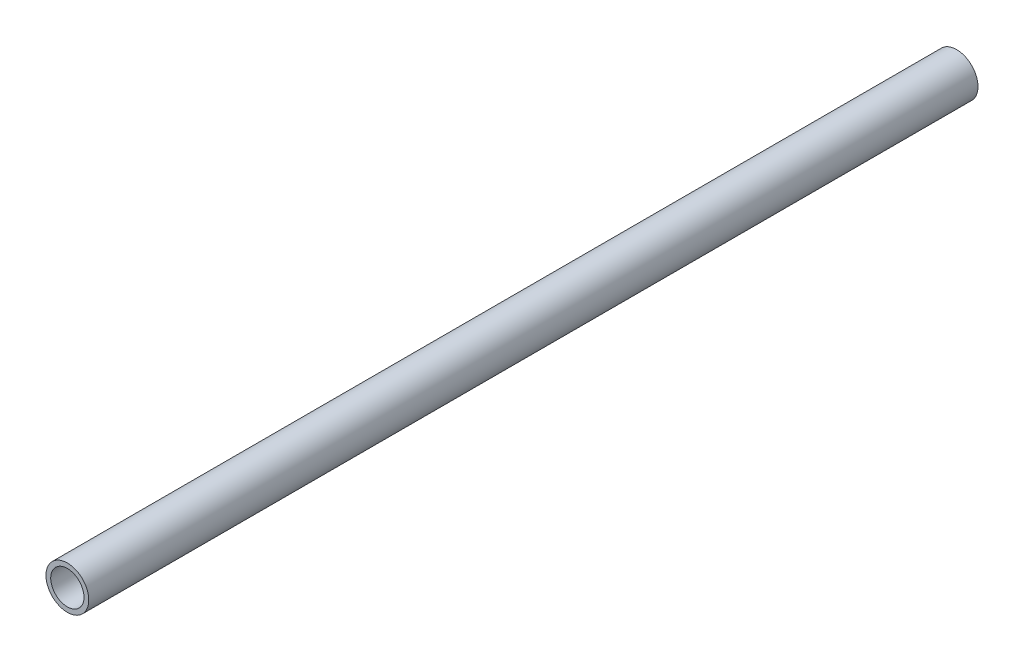
ISO-10303-21;
HEADER;
FILE_DESCRIPTION(('STEP AP214'),'2;1');
FILE_NAME('part.step','',(''),(''),'','','');
FILE_SCHEMA(('AUTOMOTIVE_DESIGN { 1 0 10303 214 1 1 1 1 }'));
ENDSEC;
DATA;
#1=APPLICATION_CONTEXT('core data for automotive mechanical design processes');
#2=APPLICATION_PROTOCOL_DEFINITION('international standard','automotive_design',2000,#1);
#3=PRODUCT_CONTEXT('',#1,'mechanical');
#4=PRODUCT('Part','Part','',(#3));
#5=PRODUCT_RELATED_PRODUCT_CATEGORY('part','',(#4));
#6=PRODUCT_DEFINITION_FORMATION('','',#4);
#7=PRODUCT_DEFINITION_CONTEXT('part definition',#1,'design');
#8=PRODUCT_DEFINITION('design','',#6,#7);
#9=PRODUCT_DEFINITION_SHAPE('','',#8);
#10=(LENGTH_UNIT() NAMED_UNIT(*) SI_UNIT(.MILLI.,.METRE.));
#11=(NAMED_UNIT(*) PLANE_ANGLE_UNIT() SI_UNIT($,.RADIAN.));
#12=(NAMED_UNIT(*) SI_UNIT($,.STERADIAN.) SOLID_ANGLE_UNIT());
#13=UNCERTAINTY_MEASURE_WITH_UNIT(LENGTH_MEASURE(1.E-05),#10,'distance_accuracy_value','');
#14=(GEOMETRIC_REPRESENTATION_CONTEXT(3) GLOBAL_UNCERTAINTY_ASSIGNED_CONTEXT((#13)) GLOBAL_UNIT_ASSIGNED_CONTEXT((#10,
#11,#12)) REPRESENTATION_CONTEXT('',''));
#15=CARTESIAN_POINT('',(0.,0.,0.));
#16=DIRECTION('',(0.,0.,1.));
#17=DIRECTION('',(1.,0.,0.));
#18=AXIS2_PLACEMENT_3D('',#15,#16,#17);
#19=CARTESIAN_POINT('',(0.,0.,373.98));
#20=DIRECTION('',(0.,0.,1.));
#21=DIRECTION('',(1.,0.,0.));
#22=AXIS2_PLACEMENT_3D('',#19,#20,#21);
#23=PLANE('',#22);
#24=CARTESIAN_POINT('',(0.,0.,373.98));
#25=DIRECTION('',(0.,0.,1.));
#26=DIRECTION('',(1.,0.,0.));
#27=AXIS2_PLACEMENT_3D('',#24,#25,#26);
#28=CIRCLE('',#27,9.);
#29=CARTESIAN_POINT('',(9.,0.,373.98));
#30=VERTEX_POINT('',#29);
#31=EDGE_CURVE('E10',#30,#30,#28,.T.);
#32=ORIENTED_EDGE('',*,*,#31,.T.);
#33=EDGE_LOOP('',(#32));
#34=FACE_BOUND('',#33,.T.);
#35=CARTESIAN_POINT('',(0.,0.,373.98));
#36=DIRECTION('',(0.,0.,1.));
#37=DIRECTION('',(1.,0.,0.));
#38=AXIS2_PLACEMENT_3D('',#35,#36,#37);
#39=CIRCLE('',#38,7.);
#40=CARTESIAN_POINT('',(7.,0.,373.98));
#41=VERTEX_POINT('',#40);
#42=EDGE_CURVE('E50',#41,#41,#39,.T.);
#43=ORIENTED_EDGE('',*,*,#42,.F.);
#44=EDGE_LOOP('',(#43));
#45=FACE_BOUND('',#44,.T.);
#46=ADVANCED_FACE('F37',(#34,#45),#23,.T.);
#47=CARTESIAN_POINT('',(0.,0.,0.));
#48=DIRECTION('',(0.,0.,1.));
#49=DIRECTION('',(1.,0.,0.));
#50=AXIS2_PLACEMENT_3D('',#47,#48,#49);
#51=PLANE('',#50);
#52=CARTESIAN_POINT('',(0.,0.,0.));
#53=DIRECTION('',(0.,0.,1.));
#54=DIRECTION('',(1.,0.,0.));
#55=AXIS2_PLACEMENT_3D('',#52,#53,#54);
#56=CIRCLE('',#55,9.);
#57=CARTESIAN_POINT('',(9.,0.,0.));
#58=VERTEX_POINT('',#57);
#59=EDGE_CURVE('E41',#58,#58,#56,.T.);
#60=ORIENTED_EDGE('',*,*,#59,.F.);
#61=EDGE_LOOP('',(#60));
#62=FACE_BOUND('',#61,.T.);
#63=CARTESIAN_POINT('',(0.,0.,0.));
#64=DIRECTION('',(0.,0.,1.));
#65=DIRECTION('',(1.,0.,0.));
#66=AXIS2_PLACEMENT_3D('',#63,#64,#65);
#67=CIRCLE('',#66,7.);
#68=CARTESIAN_POINT('',(7.,0.,0.));
#69=VERTEX_POINT('',#68);
#70=EDGE_CURVE('E52',#69,#69,#67,.T.);
#71=ORIENTED_EDGE('',*,*,#70,.T.);
#72=EDGE_LOOP('',(#71));
#73=FACE_BOUND('',#72,.T.);
#74=ADVANCED_FACE('F64',(#62,#73),#51,.F.);
#75=CARTESIAN_POINT('',(0.,0.,373.98));
#76=DIRECTION('',(0.,0.,-1.));
#77=DIRECTION('',(-1.,0.,0.));
#78=AXIS2_PLACEMENT_3D('',#75,#76,#77);
#79=CYLINDRICAL_SURFACE('',#78,9.);
#80=ORIENTED_EDGE('',*,*,#31,.F.);
#81=EDGE_LOOP('',(#80));
#82=FACE_BOUND('',#81,.T.);
#83=ORIENTED_EDGE('',*,*,#59,.T.);
#84=EDGE_LOOP('',(#83));
#85=FACE_BOUND('',#84,.T.);
#86=ADVANCED_FACE('F39',(#82,#85),#79,.T.);
#87=CARTESIAN_POINT('',(0.,0.,373.98));
#88=DIRECTION('',(0.,0.,-1.));
#89=DIRECTION('',(-1.,0.,0.));
#90=AXIS2_PLACEMENT_3D('',#87,#88,#89);
#91=CYLINDRICAL_SURFACE('',#90,7.);
#92=ORIENTED_EDGE('',*,*,#42,.T.);
#93=EDGE_LOOP('',(#92));
#94=FACE_BOUND('',#93,.T.);
#95=ORIENTED_EDGE('',*,*,#70,.F.);
#96=EDGE_LOOP('',(#95));
#97=FACE_BOUND('',#96,.T.);
#98=ADVANCED_FACE('F60',(#94,#97),#91,.F.);
#99=CLOSED_SHELL('',(#46,#74,#86,#98));
#100=MANIFOLD_SOLID_BREP('B2',#99);
#101=ADVANCED_BREP_SHAPE_REPRESENTATION('',(#18,#100),#14);
#102=SHAPE_DEFINITION_REPRESENTATION(#9,#101);
ENDSEC;
END-ISO-10303-21;
